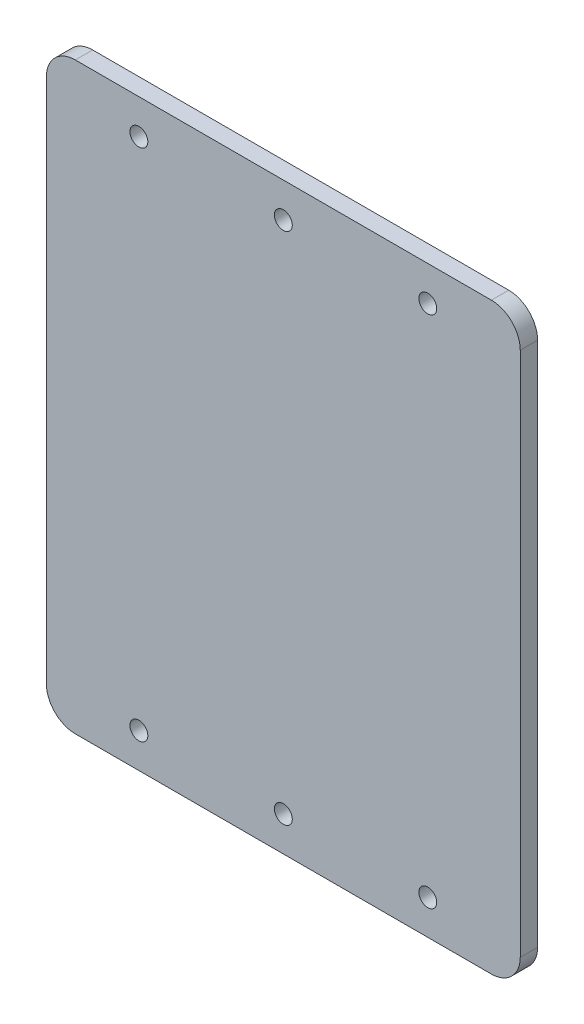
ISO-10303-21;
HEADER;
FILE_DESCRIPTION(('STEP AP214'),'2;1');
FILE_NAME('part.step','',(''),(''),'','','');
FILE_SCHEMA(('AUTOMOTIVE_DESIGN { 1 0 10303 214 1 1 1 1 }'));
ENDSEC;
DATA;
#1=APPLICATION_CONTEXT('core data for automotive mechanical design processes');
#2=APPLICATION_PROTOCOL_DEFINITION('international standard','automotive_design',2000,#1);
#3=PRODUCT_CONTEXT('',#1,'mechanical');
#4=PRODUCT('Part','Part','',(#3));
#5=PRODUCT_RELATED_PRODUCT_CATEGORY('part','',(#4));
#6=PRODUCT_DEFINITION_FORMATION('','',#4);
#7=PRODUCT_DEFINITION_CONTEXT('part definition',#1,'design');
#8=PRODUCT_DEFINITION('design','',#6,#7);
#9=PRODUCT_DEFINITION_SHAPE('','',#8);
#10=(LENGTH_UNIT() NAMED_UNIT(*) SI_UNIT(.MILLI.,.METRE.));
#11=(NAMED_UNIT(*) PLANE_ANGLE_UNIT() SI_UNIT($,.RADIAN.));
#12=(NAMED_UNIT(*) SI_UNIT($,.STERADIAN.) SOLID_ANGLE_UNIT());
#13=UNCERTAINTY_MEASURE_WITH_UNIT(LENGTH_MEASURE(1.E-05),#10,'distance_accuracy_value','');
#14=(GEOMETRIC_REPRESENTATION_CONTEXT(3) GLOBAL_UNCERTAINTY_ASSIGNED_CONTEXT((#13)) GLOBAL_UNIT_ASSIGNED_CONTEXT((#10,
#11,#12)) REPRESENTATION_CONTEXT('',''));
#15=CARTESIAN_POINT('',(0.,0.,0.));
#16=DIRECTION('',(0.,0.,1.));
#17=DIRECTION('',(1.,0.,0.));
#18=AXIS2_PLACEMENT_3D('',#15,#16,#17);
#19=CARTESIAN_POINT('',(0.,0.,3.));
#20=DIRECTION('',(0.,0.,-1.));
#21=DIRECTION('',(-1.,0.,0.));
#22=AXIS2_PLACEMENT_3D('',#19,#20,#21);
#23=PLANE('',#22);
#24=DIRECTION('',(0.,-1.,0.));
#25=VECTOR('',#24,1.);
#26=CARTESIAN_POINT('',(0.,0.,3.));
#27=LINE('',#26,#25);
#28=CARTESIAN_POINT('',(0.,96.,3.));
#29=VERTEX_POINT('',#28);
#30=CARTESIAN_POINT('',(0.,5.,3.));
#31=VERTEX_POINT('',#30);
#32=EDGE_CURVE('E147',#29,#31,#27,.T.);
#33=ORIENTED_EDGE('',*,*,#32,.T.);
#34=CARTESIAN_POINT('',(5.,5.,3.));
#35=DIRECTION('',(0.,0.,-1.));
#36=DIRECTION('',(-1.,0.,0.));
#37=AXIS2_PLACEMENT_3D('',#34,#35,#36);
#38=CIRCLE('',#37,5.);
#39=CARTESIAN_POINT('',(5.,0.,3.));
#40=VERTEX_POINT('',#39);
#41=EDGE_CURVE('E162',#31,#40,#38,.F.);
#42=ORIENTED_EDGE('',*,*,#41,.T.);
#43=DIRECTION('',(1.,0.,0.));
#44=VECTOR('',#43,1.);
#45=CARTESIAN_POINT('',(0.,0.,3.));
#46=LINE('',#45,#44);
#47=CARTESIAN_POINT('',(77.,0.,3.));
#48=VERTEX_POINT('',#47);
#49=EDGE_CURVE('E129',#40,#48,#46,.T.);
#50=ORIENTED_EDGE('',*,*,#49,.T.);
#51=CARTESIAN_POINT('',(77.,5.,3.));
#52=DIRECTION('',(0.,0.,-1.));
#53=DIRECTION('',(-1.,0.,0.));
#54=AXIS2_PLACEMENT_3D('',#51,#52,#53);
#55=CIRCLE('',#54,5.);
#56=CARTESIAN_POINT('',(82.,5.,3.));
#57=VERTEX_POINT('',#56);
#58=EDGE_CURVE('E160',#48,#57,#55,.F.);
#59=ORIENTED_EDGE('',*,*,#58,.T.);
#60=DIRECTION('',(0.,1.,0.));
#61=VECTOR('',#60,1.);
#62=CARTESIAN_POINT('',(82.,0.,3.));
#63=LINE('',#62,#61);
#64=CARTESIAN_POINT('',(82.,96.,3.));
#65=VERTEX_POINT('',#64);
#66=EDGE_CURVE('E173',#57,#65,#63,.T.);
#67=ORIENTED_EDGE('',*,*,#66,.T.);
#68=CARTESIAN_POINT('',(77.,96.,3.));
#69=DIRECTION('',(0.,0.,-1.));
#70=DIRECTION('',(-1.,0.,0.));
#71=AXIS2_PLACEMENT_3D('',#68,#69,#70);
#72=CIRCLE('',#71,5.);
#73=CARTESIAN_POINT('',(77.,101.,3.));
#74=VERTEX_POINT('',#73);
#75=EDGE_CURVE('E64',#65,#74,#72,.F.);
#76=ORIENTED_EDGE('',*,*,#75,.T.);
#77=DIRECTION('',(-1.,0.,0.));
#78=VECTOR('',#77,1.);
#79=CARTESIAN_POINT('',(0.,101.,3.));
#80=LINE('',#79,#78);
#81=CARTESIAN_POINT('',(5.,101.,3.));
#82=VERTEX_POINT('',#81);
#83=EDGE_CURVE('E148',#74,#82,#80,.T.);
#84=ORIENTED_EDGE('',*,*,#83,.T.);
#85=CARTESIAN_POINT('',(5.,96.,3.));
#86=DIRECTION('',(0.,0.,-1.));
#87=DIRECTION('',(-1.,0.,0.));
#88=AXIS2_PLACEMENT_3D('',#85,#86,#87);
#89=CIRCLE('',#88,5.);
#90=EDGE_CURVE('E157',#82,#29,#89,.F.);
#91=ORIENTED_EDGE('',*,*,#90,.T.);
#92=EDGE_LOOP('',(#33,#42,#50,#59,#67,#76,#84,#91));
#93=FACE_BOUND('',#92,.T.);
#94=CARTESIAN_POINT('',(41.,6.,3.));
#95=DIRECTION('',(0.,0.,1.));
#96=DIRECTION('',(1.,0.,0.));
#97=AXIS2_PLACEMENT_3D('',#94,#95,#96);
#98=CIRCLE('',#97,1.55);
#99=CARTESIAN_POINT('',(42.55,6.,3.));
#100=VERTEX_POINT('',#99);
#101=EDGE_CURVE('E142',#100,#100,#98,.T.);
#102=ORIENTED_EDGE('',*,*,#101,.F.);
#103=EDGE_LOOP('',(#102));
#104=FACE_BOUND('',#103,.T.);
#105=CARTESIAN_POINT('',(66.,6.,3.));
#106=DIRECTION('',(0.,0.,1.));
#107=DIRECTION('',(1.,0.,0.));
#108=AXIS2_PLACEMENT_3D('',#105,#106,#107);
#109=CIRCLE('',#108,1.54999999999999);
#110=CARTESIAN_POINT('',(67.55,6.,3.));
#111=VERTEX_POINT('',#110);
#112=EDGE_CURVE('E190',#111,#111,#109,.T.);
#113=ORIENTED_EDGE('',*,*,#112,.F.);
#114=EDGE_LOOP('',(#113));
#115=FACE_BOUND('',#114,.T.);
#116=CARTESIAN_POINT('',(16.,6.,3.));
#117=DIRECTION('',(0.,0.,1.));
#118=DIRECTION('',(1.,0.,0.));
#119=AXIS2_PLACEMENT_3D('',#116,#117,#118);
#120=CIRCLE('',#119,1.55);
#121=CARTESIAN_POINT('',(17.55,6.,3.));
#122=VERTEX_POINT('',#121);
#123=EDGE_CURVE('E196',#122,#122,#120,.T.);
#124=ORIENTED_EDGE('',*,*,#123,.F.);
#125=EDGE_LOOP('',(#124));
#126=FACE_BOUND('',#125,.T.);
#127=CARTESIAN_POINT('',(41.,95.,3.));
#128=DIRECTION('',(0.,0.,1.));
#129=DIRECTION('',(1.,0.,0.));
#130=AXIS2_PLACEMENT_3D('',#127,#128,#129);
#131=CIRCLE('',#130,1.55);
#132=CARTESIAN_POINT('',(42.55,95.,3.));
#133=VERTEX_POINT('',#132);
#134=EDGE_CURVE('E202',#133,#133,#131,.T.);
#135=ORIENTED_EDGE('',*,*,#134,.F.);
#136=EDGE_LOOP('',(#135));
#137=FACE_BOUND('',#136,.T.);
#138=CARTESIAN_POINT('',(66.,95.,3.));
#139=DIRECTION('',(0.,0.,1.));
#140=DIRECTION('',(1.,0.,0.));
#141=AXIS2_PLACEMENT_3D('',#138,#139,#140);
#142=CIRCLE('',#141,1.54999999999999);
#143=CARTESIAN_POINT('',(67.55,95.,3.));
#144=VERTEX_POINT('',#143);
#145=EDGE_CURVE('E208',#144,#144,#142,.T.);
#146=ORIENTED_EDGE('',*,*,#145,.F.);
#147=EDGE_LOOP('',(#146));
#148=FACE_BOUND('',#147,.T.);
#149=CARTESIAN_POINT('',(16.,95.,3.));
#150=DIRECTION('',(0.,0.,1.));
#151=DIRECTION('',(1.,0.,0.));
#152=AXIS2_PLACEMENT_3D('',#149,#150,#151);
#153=CIRCLE('',#152,1.54999999999999);
#154=CARTESIAN_POINT('',(17.55,95.,3.));
#155=VERTEX_POINT('',#154);
#156=EDGE_CURVE('E214',#155,#155,#153,.T.);
#157=ORIENTED_EDGE('',*,*,#156,.F.);
#158=EDGE_LOOP('',(#157));
#159=FACE_BOUND('',#158,.T.);
#160=ADVANCED_FACE('F43',(#93,#104,#115,#126,#137,#148,#159),#23,.F.);
#161=CARTESIAN_POINT('',(0.,0.,0.));
#162=DIRECTION('',(0.,0.,-1.));
#163=DIRECTION('',(-1.,0.,0.));
#164=AXIS2_PLACEMENT_3D('',#161,#162,#163);
#165=PLANE('',#164);
#166=CARTESIAN_POINT('',(66.,95.,0.));
#167=DIRECTION('',(0.,0.,1.));
#168=DIRECTION('',(1.,0.,0.));
#169=AXIS2_PLACEMENT_3D('',#166,#167,#168);
#170=CIRCLE('',#169,1.54999999999999);
#171=CARTESIAN_POINT('',(67.55,95.,0.));
#172=VERTEX_POINT('',#171);
#173=EDGE_CURVE('E211',#172,#172,#170,.T.);
#174=ORIENTED_EDGE('',*,*,#173,.T.);
#175=EDGE_LOOP('',(#174));
#176=FACE_BOUND('',#175,.T.);
#177=CARTESIAN_POINT('',(16.,6.,0.));
#178=DIRECTION('',(0.,0.,1.));
#179=DIRECTION('',(1.,0.,0.));
#180=AXIS2_PLACEMENT_3D('',#177,#178,#179);
#181=CIRCLE('',#180,1.55);
#182=CARTESIAN_POINT('',(17.55,6.,0.));
#183=VERTEX_POINT('',#182);
#184=EDGE_CURVE('E199',#183,#183,#181,.T.);
#185=ORIENTED_EDGE('',*,*,#184,.T.);
#186=EDGE_LOOP('',(#185));
#187=FACE_BOUND('',#186,.T.);
#188=CARTESIAN_POINT('',(41.,6.,0.));
#189=DIRECTION('',(0.,0.,1.));
#190=DIRECTION('',(1.,0.,0.));
#191=AXIS2_PLACEMENT_3D('',#188,#189,#190);
#192=CIRCLE('',#191,1.55);
#193=CARTESIAN_POINT('',(42.55,6.,0.));
#194=VERTEX_POINT('',#193);
#195=EDGE_CURVE('E187',#194,#194,#192,.T.);
#196=ORIENTED_EDGE('',*,*,#195,.T.);
#197=EDGE_LOOP('',(#196));
#198=FACE_BOUND('',#197,.T.);
#199=DIRECTION('',(1.,0.,0.));
#200=VECTOR('',#199,1.);
#201=CARTESIAN_POINT('',(0.,0.,0.));
#202=LINE('',#201,#200);
#203=CARTESIAN_POINT('',(5.,0.,0.));
#204=VERTEX_POINT('',#203);
#205=CARTESIAN_POINT('',(77.,0.,0.));
#206=VERTEX_POINT('',#205);
#207=EDGE_CURVE('E126',#204,#206,#202,.T.);
#208=ORIENTED_EDGE('',*,*,#207,.F.);
#209=CARTESIAN_POINT('',(5.,5.,0.));
#210=DIRECTION('',(0.,0.,-1.));
#211=DIRECTION('',(-1.,0.,0.));
#212=AXIS2_PLACEMENT_3D('',#209,#210,#211);
#213=CIRCLE('',#212,5.);
#214=CARTESIAN_POINT('',(0.,5.,0.));
#215=VERTEX_POINT('',#214);
#216=EDGE_CURVE('E109',#204,#215,#213,.T.);
#217=ORIENTED_EDGE('',*,*,#216,.T.);
#218=DIRECTION('',(0.,-1.,0.));
#219=VECTOR('',#218,1.);
#220=CARTESIAN_POINT('',(0.,0.,0.));
#221=LINE('',#220,#219);
#222=CARTESIAN_POINT('',(0.,96.,0.));
#223=VERTEX_POINT('',#222);
#224=EDGE_CURVE('E137',#223,#215,#221,.T.);
#225=ORIENTED_EDGE('',*,*,#224,.F.);
#226=CARTESIAN_POINT('',(5.,96.,0.));
#227=DIRECTION('',(0.,0.,-1.));
#228=DIRECTION('',(-1.,0.,0.));
#229=AXIS2_PLACEMENT_3D('',#226,#227,#228);
#230=CIRCLE('',#229,5.);
#231=CARTESIAN_POINT('',(5.,101.,0.));
#232=VERTEX_POINT('',#231);
#233=EDGE_CURVE('E130',#223,#232,#230,.T.);
#234=ORIENTED_EDGE('',*,*,#233,.T.);
#235=DIRECTION('',(-1.,0.,0.));
#236=VECTOR('',#235,1.);
#237=CARTESIAN_POINT('',(0.,101.,0.));
#238=LINE('',#237,#236);
#239=CARTESIAN_POINT('',(77.,101.,0.));
#240=VERTEX_POINT('',#239);
#241=EDGE_CURVE('E140',#240,#232,#238,.T.);
#242=ORIENTED_EDGE('',*,*,#241,.F.);
#243=CARTESIAN_POINT('',(77.,96.,0.));
#244=DIRECTION('',(0.,0.,-1.));
#245=DIRECTION('',(-1.,0.,0.));
#246=AXIS2_PLACEMENT_3D('',#243,#244,#245);
#247=CIRCLE('',#246,5.);
#248=CARTESIAN_POINT('',(82.,96.,0.));
#249=VERTEX_POINT('',#248);
#250=EDGE_CURVE('E151',#240,#249,#247,.T.);
#251=ORIENTED_EDGE('',*,*,#250,.T.);
#252=DIRECTION('',(0.,1.,0.));
#253=VECTOR('',#252,1.);
#254=CARTESIAN_POINT('',(82.,0.,0.));
#255=LINE('',#254,#253);
#256=CARTESIAN_POINT('',(82.,5.,0.));
#257=VERTEX_POINT('',#256);
#258=EDGE_CURVE('E136',#257,#249,#255,.T.);
#259=ORIENTED_EDGE('',*,*,#258,.F.);
#260=CARTESIAN_POINT('',(77.,5.,0.));
#261=DIRECTION('',(0.,0.,-1.));
#262=DIRECTION('',(-1.,0.,0.));
#263=AXIS2_PLACEMENT_3D('',#260,#261,#262);
#264=CIRCLE('',#263,5.);
#265=EDGE_CURVE('E120',#257,#206,#264,.T.);
#266=ORIENTED_EDGE('',*,*,#265,.T.);
#267=EDGE_LOOP('',(#208,#217,#225,#234,#242,#251,#259,#266));
#268=FACE_BOUND('',#267,.T.);
#269=CARTESIAN_POINT('',(66.,6.,0.));
#270=DIRECTION('',(0.,0.,1.));
#271=DIRECTION('',(1.,0.,0.));
#272=AXIS2_PLACEMENT_3D('',#269,#270,#271);
#273=CIRCLE('',#272,1.54999999999999);
#274=CARTESIAN_POINT('',(67.55,6.,0.));
#275=VERTEX_POINT('',#274);
#276=EDGE_CURVE('E193',#275,#275,#273,.T.);
#277=ORIENTED_EDGE('',*,*,#276,.T.);
#278=EDGE_LOOP('',(#277));
#279=FACE_BOUND('',#278,.T.);
#280=CARTESIAN_POINT('',(41.,95.,0.));
#281=DIRECTION('',(0.,0.,1.));
#282=DIRECTION('',(1.,0.,0.));
#283=AXIS2_PLACEMENT_3D('',#280,#281,#282);
#284=CIRCLE('',#283,1.55);
#285=CARTESIAN_POINT('',(42.55,95.,0.));
#286=VERTEX_POINT('',#285);
#287=EDGE_CURVE('E205',#286,#286,#284,.T.);
#288=ORIENTED_EDGE('',*,*,#287,.T.);
#289=EDGE_LOOP('',(#288));
#290=FACE_BOUND('',#289,.T.);
#291=CARTESIAN_POINT('',(16.,95.,0.));
#292=DIRECTION('',(0.,0.,1.));
#293=DIRECTION('',(1.,0.,0.));
#294=AXIS2_PLACEMENT_3D('',#291,#292,#293);
#295=CIRCLE('',#294,1.54999999999999);
#296=CARTESIAN_POINT('',(17.55,95.,0.));
#297=VERTEX_POINT('',#296);
#298=EDGE_CURVE('E217',#297,#297,#295,.T.);
#299=ORIENTED_EDGE('',*,*,#298,.T.);
#300=EDGE_LOOP('',(#299));
#301=FACE_BOUND('',#300,.T.);
#302=ADVANCED_FACE('F133',(#176,#187,#198,#268,#279,#290,#301),#165,.T.);
#303=CARTESIAN_POINT('',(0.,0.,3.));
#304=DIRECTION('',(1.,0.,0.));
#305=DIRECTION('',(0.,0.,-1.));
#306=AXIS2_PLACEMENT_3D('',#303,#304,#305);
#307=PLANE('',#306);
#308=ORIENTED_EDGE('',*,*,#224,.T.);
#309=DIRECTION('',(0.,0.,-1.));
#310=VECTOR('',#309,1.);
#311=CARTESIAN_POINT('',(0.,5.,3.));
#312=LINE('',#311,#310);
#313=EDGE_CURVE('E114',#215,#31,#312,.F.);
#314=ORIENTED_EDGE('',*,*,#313,.T.);
#315=ORIENTED_EDGE('',*,*,#32,.F.);
#316=DIRECTION('',(0.,0.,-1.));
#317=VECTOR('',#316,1.);
#318=CARTESIAN_POINT('',(0.,96.,3.));
#319=LINE('',#318,#317);
#320=EDGE_CURVE('E119',#29,#223,#319,.T.);
#321=ORIENTED_EDGE('',*,*,#320,.T.);
#322=EDGE_LOOP('',(#308,#314,#315,#321));
#323=FACE_BOUND('',#322,.T.);
#324=ADVANCED_FACE('F232',(#323),#307,.F.);
#325=CARTESIAN_POINT('',(0.,0.,3.));
#326=DIRECTION('',(0.,1.,0.));
#327=DIRECTION('',(0.,0.,1.));
#328=AXIS2_PLACEMENT_3D('',#325,#326,#327);
#329=PLANE('',#328);
#330=ORIENTED_EDGE('',*,*,#49,.F.);
#331=DIRECTION('',(0.,0.,-1.));
#332=VECTOR('',#331,1.);
#333=CARTESIAN_POINT('',(5.,0.,3.));
#334=LINE('',#333,#332);
#335=EDGE_CURVE('E113',#40,#204,#334,.T.);
#336=ORIENTED_EDGE('',*,*,#335,.T.);
#337=ORIENTED_EDGE('',*,*,#207,.T.);
#338=DIRECTION('',(0.,0.,-1.));
#339=VECTOR('',#338,1.);
#340=CARTESIAN_POINT('',(77.,0.,3.));
#341=LINE('',#340,#339);
#342=EDGE_CURVE('E131',#206,#48,#341,.F.);
#343=ORIENTED_EDGE('',*,*,#342,.T.);
#344=EDGE_LOOP('',(#330,#336,#337,#343));
#345=FACE_BOUND('',#344,.T.);
#346=ADVANCED_FACE('F125',(#345),#329,.F.);
#347=CARTESIAN_POINT('',(82.,0.,3.));
#348=DIRECTION('',(-1.,0.,0.));
#349=DIRECTION('',(0.,0.,1.));
#350=AXIS2_PLACEMENT_3D('',#347,#348,#349);
#351=PLANE('',#350);
#352=ORIENTED_EDGE('',*,*,#66,.F.);
#353=DIRECTION('',(0.,0.,-1.));
#354=VECTOR('',#353,1.);
#355=CARTESIAN_POINT('',(82.,5.,3.));
#356=LINE('',#355,#354);
#357=EDGE_CURVE('E166',#57,#257,#356,.T.);
#358=ORIENTED_EDGE('',*,*,#357,.T.);
#359=ORIENTED_EDGE('',*,*,#258,.T.);
#360=DIRECTION('',(0.,0.,-1.));
#361=VECTOR('',#360,1.);
#362=CARTESIAN_POINT('',(82.,96.,3.));
#363=LINE('',#362,#361);
#364=EDGE_CURVE('E164',#249,#65,#363,.F.);
#365=ORIENTED_EDGE('',*,*,#364,.T.);
#366=EDGE_LOOP('',(#352,#358,#359,#365));
#367=FACE_BOUND('',#366,.T.);
#368=ADVANCED_FACE('F171',(#367),#351,.F.);
#369=CARTESIAN_POINT('',(0.,101.,3.));
#370=DIRECTION('',(0.,-1.,0.));
#371=DIRECTION('',(0.,0.,-1.));
#372=AXIS2_PLACEMENT_3D('',#369,#370,#371);
#373=PLANE('',#372);
#374=ORIENTED_EDGE('',*,*,#83,.F.);
#375=DIRECTION('',(0.,0.,-1.));
#376=VECTOR('',#375,1.);
#377=CARTESIAN_POINT('',(77.,101.,3.));
#378=LINE('',#377,#376);
#379=EDGE_CURVE('E11',#74,#240,#378,.T.);
#380=ORIENTED_EDGE('',*,*,#379,.T.);
#381=ORIENTED_EDGE('',*,*,#241,.T.);
#382=DIRECTION('',(0.,0.,-1.));
#383=VECTOR('',#382,1.);
#384=CARTESIAN_POINT('',(5.,101.,3.));
#385=LINE('',#384,#383);
#386=EDGE_CURVE('E51',#232,#82,#385,.F.);
#387=ORIENTED_EDGE('',*,*,#386,.T.);
#388=EDGE_LOOP('',(#374,#380,#381,#387));
#389=FACE_BOUND('',#388,.T.);
#390=ADVANCED_FACE('F180',(#389),#373,.F.);
#391=CARTESIAN_POINT('',(41.,6.,3.));
#392=DIRECTION('',(0.,0.,-1.));
#393=DIRECTION('',(-1.,0.,0.));
#394=AXIS2_PLACEMENT_3D('',#391,#392,#393);
#395=CYLINDRICAL_SURFACE('',#394,1.55);
#396=ORIENTED_EDGE('',*,*,#101,.T.);
#397=EDGE_LOOP('',(#396));
#398=FACE_BOUND('',#397,.T.);
#399=ORIENTED_EDGE('',*,*,#195,.F.);
#400=EDGE_LOOP('',(#399));
#401=FACE_BOUND('',#400,.T.);
#402=ADVANCED_FACE('F237',(#398,#401),#395,.F.);
#403=CARTESIAN_POINT('',(66.,6.,3.));
#404=DIRECTION('',(0.,0.,-1.));
#405=DIRECTION('',(-1.,0.,0.));
#406=AXIS2_PLACEMENT_3D('',#403,#404,#405);
#407=CYLINDRICAL_SURFACE('',#406,1.54999999999999);
#408=ORIENTED_EDGE('',*,*,#112,.T.);
#409=EDGE_LOOP('',(#408));
#410=FACE_BOUND('',#409,.T.);
#411=ORIENTED_EDGE('',*,*,#276,.F.);
#412=EDGE_LOOP('',(#411));
#413=FACE_BOUND('',#412,.T.);
#414=ADVANCED_FACE('F316',(#410,#413),#407,.F.);
#415=CARTESIAN_POINT('',(16.,6.,3.));
#416=DIRECTION('',(0.,0.,-1.));
#417=DIRECTION('',(-1.,0.,0.));
#418=AXIS2_PLACEMENT_3D('',#415,#416,#417);
#419=CYLINDRICAL_SURFACE('',#418,1.55);
#420=ORIENTED_EDGE('',*,*,#123,.T.);
#421=EDGE_LOOP('',(#420));
#422=FACE_BOUND('',#421,.T.);
#423=ORIENTED_EDGE('',*,*,#184,.F.);
#424=EDGE_LOOP('',(#423));
#425=FACE_BOUND('',#424,.T.);
#426=ADVANCED_FACE('F306',(#422,#425),#419,.F.);
#427=CARTESIAN_POINT('',(41.,95.,3.));
#428=DIRECTION('',(0.,0.,-1.));
#429=DIRECTION('',(-1.,0.,0.));
#430=AXIS2_PLACEMENT_3D('',#427,#428,#429);
#431=CYLINDRICAL_SURFACE('',#430,1.55);
#432=ORIENTED_EDGE('',*,*,#134,.T.);
#433=EDGE_LOOP('',(#432));
#434=FACE_BOUND('',#433,.T.);
#435=ORIENTED_EDGE('',*,*,#287,.F.);
#436=EDGE_LOOP('',(#435));
#437=FACE_BOUND('',#436,.T.);
#438=ADVANCED_FACE('F296',(#434,#437),#431,.F.);
#439=CARTESIAN_POINT('',(66.,95.,3.));
#440=DIRECTION('',(0.,0.,-1.));
#441=DIRECTION('',(-1.,0.,0.));
#442=AXIS2_PLACEMENT_3D('',#439,#440,#441);
#443=CYLINDRICAL_SURFACE('',#442,1.54999999999999);
#444=ORIENTED_EDGE('',*,*,#145,.T.);
#445=EDGE_LOOP('',(#444));
#446=FACE_BOUND('',#445,.T.);
#447=ORIENTED_EDGE('',*,*,#173,.F.);
#448=EDGE_LOOP('',(#447));
#449=FACE_BOUND('',#448,.T.);
#450=ADVANCED_FACE('F287',(#446,#449),#443,.F.);
#451=CARTESIAN_POINT('',(16.,95.,3.));
#452=DIRECTION('',(0.,0.,-1.));
#453=DIRECTION('',(-1.,0.,0.));
#454=AXIS2_PLACEMENT_3D('',#451,#452,#453);
#455=CYLINDRICAL_SURFACE('',#454,1.54999999999999);
#456=ORIENTED_EDGE('',*,*,#156,.T.);
#457=EDGE_LOOP('',(#456));
#458=FACE_BOUND('',#457,.T.);
#459=ORIENTED_EDGE('',*,*,#298,.F.);
#460=EDGE_LOOP('',(#459));
#461=FACE_BOUND('',#460,.T.);
#462=ADVANCED_FACE('F223',(#458,#461),#455,.F.);
#463=CARTESIAN_POINT('',(5.,5.,3.));
#464=DIRECTION('',(0.,0.,-1.));
#465=DIRECTION('',(-1.,0.,0.));
#466=AXIS2_PLACEMENT_3D('',#463,#464,#465);
#467=CYLINDRICAL_SURFACE('',#466,5.);
#468=ORIENTED_EDGE('',*,*,#41,.F.);
#469=ORIENTED_EDGE('',*,*,#313,.F.);
#470=ORIENTED_EDGE('',*,*,#216,.F.);
#471=ORIENTED_EDGE('',*,*,#335,.F.);
#472=EDGE_LOOP('',(#468,#469,#470,#471));
#473=FACE_BOUND('',#472,.T.);
#474=ADVANCED_FACE('F112',(#473),#467,.T.);
#475=CARTESIAN_POINT('',(77.,5.,3.));
#476=DIRECTION('',(0.,0.,-1.));
#477=DIRECTION('',(-1.,0.,0.));
#478=AXIS2_PLACEMENT_3D('',#475,#476,#477);
#479=CYLINDRICAL_SURFACE('',#478,5.);
#480=ORIENTED_EDGE('',*,*,#58,.F.);
#481=ORIENTED_EDGE('',*,*,#342,.F.);
#482=ORIENTED_EDGE('',*,*,#265,.F.);
#483=ORIENTED_EDGE('',*,*,#357,.F.);
#484=EDGE_LOOP('',(#480,#481,#482,#483));
#485=FACE_BOUND('',#484,.T.);
#486=ADVANCED_FACE('F251',(#485),#479,.T.);
#487=CARTESIAN_POINT('',(77.,96.,3.));
#488=DIRECTION('',(0.,0.,-1.));
#489=DIRECTION('',(-1.,0.,0.));
#490=AXIS2_PLACEMENT_3D('',#487,#488,#489);
#491=CYLINDRICAL_SURFACE('',#490,5.);
#492=ORIENTED_EDGE('',*,*,#75,.F.);
#493=ORIENTED_EDGE('',*,*,#364,.F.);
#494=ORIENTED_EDGE('',*,*,#250,.F.);
#495=ORIENTED_EDGE('',*,*,#379,.F.);
#496=EDGE_LOOP('',(#492,#493,#494,#495));
#497=FACE_BOUND('',#496,.T.);
#498=ADVANCED_FACE('F179',(#497),#491,.T.);
#499=CARTESIAN_POINT('',(5.,96.,3.));
#500=DIRECTION('',(0.,0.,-1.));
#501=DIRECTION('',(-1.,0.,0.));
#502=AXIS2_PLACEMENT_3D('',#499,#500,#501);
#503=CYLINDRICAL_SURFACE('',#502,5.);
#504=ORIENTED_EDGE('',*,*,#90,.F.);
#505=ORIENTED_EDGE('',*,*,#386,.F.);
#506=ORIENTED_EDGE('',*,*,#233,.F.);
#507=ORIENTED_EDGE('',*,*,#320,.F.);
#508=EDGE_LOOP('',(#504,#505,#506,#507));
#509=FACE_BOUND('',#508,.T.);
#510=ADVANCED_FACE('F45',(#509),#503,.T.);
#511=CLOSED_SHELL('',(#160,#302,#324,#346,#368,#390,#402,#414,#426,#438,#450,#462,#474,#486,
#498,#510));
#512=MANIFOLD_SOLID_BREP('B2',#511);
#513=ADVANCED_BREP_SHAPE_REPRESENTATION('',(#18,#512),#14);
#514=SHAPE_DEFINITION_REPRESENTATION(#9,#513);
ENDSEC;
END-ISO-10303-21;
